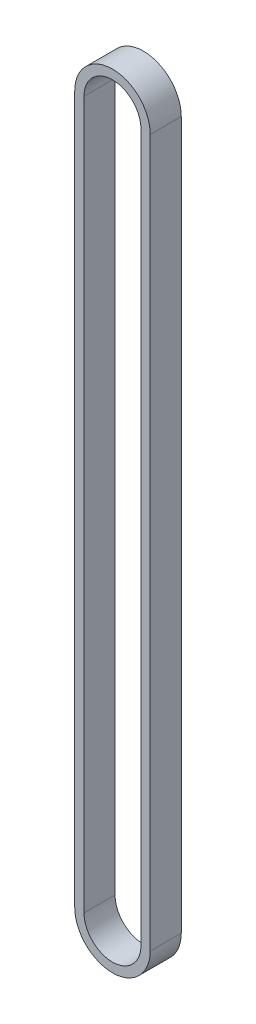
ISO-10303-21;
HEADER;
FILE_DESCRIPTION(('STEP AP214'),'2;1');
FILE_NAME('part.step','',(''),(''),'','','');
FILE_SCHEMA(('AUTOMOTIVE_DESIGN { 1 0 10303 214 1 1 1 1 }'));
ENDSEC;
DATA;
#1=APPLICATION_CONTEXT('core data for automotive mechanical design processes');
#2=APPLICATION_PROTOCOL_DEFINITION('international standard','automotive_design',2000,#1);
#3=PRODUCT_CONTEXT('',#1,'mechanical');
#4=PRODUCT('Part','Part','',(#3));
#5=PRODUCT_RELATED_PRODUCT_CATEGORY('part','',(#4));
#6=PRODUCT_DEFINITION_FORMATION('','',#4);
#7=PRODUCT_DEFINITION_CONTEXT('part definition',#1,'design');
#8=PRODUCT_DEFINITION('design','',#6,#7);
#9=PRODUCT_DEFINITION_SHAPE('','',#8);
#10=(LENGTH_UNIT() NAMED_UNIT(*) SI_UNIT(.MILLI.,.METRE.));
#11=(NAMED_UNIT(*) PLANE_ANGLE_UNIT() SI_UNIT($,.RADIAN.));
#12=(NAMED_UNIT(*) SI_UNIT($,.STERADIAN.) SOLID_ANGLE_UNIT());
#13=UNCERTAINTY_MEASURE_WITH_UNIT(LENGTH_MEASURE(1.E-05),#10,'distance_accuracy_value','');
#14=(GEOMETRIC_REPRESENTATION_CONTEXT(3) GLOBAL_UNCERTAINTY_ASSIGNED_CONTEXT((#13)) GLOBAL_UNIT_ASSIGNED_CONTEXT((#10,
#11,#12)) REPRESENTATION_CONTEXT('',''));
#15=CARTESIAN_POINT('',(0.,0.,0.));
#16=DIRECTION('',(0.,0.,1.));
#17=DIRECTION('',(1.,0.,0.));
#18=AXIS2_PLACEMENT_3D('',#15,#16,#17);
#19=CARTESIAN_POINT('',(0.,-114.,10.));
#20=DIRECTION('',(0.,0.,1.));
#21=DIRECTION('',(1.,0.,0.));
#22=AXIS2_PLACEMENT_3D('',#19,#20,#21);
#23=PLANE('',#22);
#24=CARTESIAN_POINT('',(0.,-114.,10.));
#25=DIRECTION('',(0.,0.,1.));
#26=DIRECTION('',(1.,0.,0.));
#27=AXIS2_PLACEMENT_3D('',#24,#25,#26);
#28=CIRCLE('',#27,12.17);
#29=CARTESIAN_POINT('',(-12.17,-114.,10.));
#30=VERTEX_POINT('',#29);
#31=CARTESIAN_POINT('',(12.17,-114.,10.));
#32=VERTEX_POINT('',#31);
#33=EDGE_CURVE('E157',#30,#32,#28,.T.);
#34=ORIENTED_EDGE('',*,*,#33,.T.);
#35=DIRECTION('',(0.,1.,0.));
#36=VECTOR('',#35,1.);
#37=CARTESIAN_POINT('',(12.17,-114.,10.));
#38=LINE('',#37,#36);
#39=CARTESIAN_POINT('',(12.17,114.,10.));
#40=VERTEX_POINT('',#39);
#41=EDGE_CURVE('E161',#32,#40,#38,.T.);
#42=ORIENTED_EDGE('',*,*,#41,.T.);
#43=CARTESIAN_POINT('',(0.,114.,10.));
#44=DIRECTION('',(0.,0.,1.));
#45=DIRECTION('',(1.,0.,0.));
#46=AXIS2_PLACEMENT_3D('',#43,#44,#45);
#47=CIRCLE('',#46,12.17);
#48=CARTESIAN_POINT('',(-12.17,114.,10.));
#49=VERTEX_POINT('',#48);
#50=EDGE_CURVE('E165',#40,#49,#47,.T.);
#51=ORIENTED_EDGE('',*,*,#50,.T.);
#52=DIRECTION('',(0.,-1.,0.));
#53=VECTOR('',#52,1.);
#54=CARTESIAN_POINT('',(-12.17,-114.,10.));
#55=LINE('',#54,#53);
#56=EDGE_CURVE('E168',#49,#30,#55,.T.);
#57=ORIENTED_EDGE('',*,*,#56,.T.);
#58=EDGE_LOOP('',(#34,#42,#51,#57));
#59=FACE_BOUND('',#58,.T.);
#60=DIRECTION('',(0.,1.,0.));
#61=VECTOR('',#60,1.);
#62=CARTESIAN_POINT('',(9.17000000000004,-114.,10.));
#63=LINE('',#62,#61);
#64=CARTESIAN_POINT('',(9.17000000000004,-114.,10.));
#65=VERTEX_POINT('',#64);
#66=CARTESIAN_POINT('',(9.17,114.,10.));
#67=VERTEX_POINT('',#66);
#68=EDGE_CURVE('E118',#65,#67,#63,.T.);
#69=ORIENTED_EDGE('',*,*,#68,.F.);
#70=CARTESIAN_POINT('',(0.,-114.,10.));
#71=DIRECTION('',(0.,0.,1.));
#72=DIRECTION('',(1.,0.,0.));
#73=AXIS2_PLACEMENT_3D('',#70,#71,#72);
#74=CIRCLE('',#73,9.17000000000004);
#75=CARTESIAN_POINT('',(-9.17000000000004,-114.,10.));
#76=VERTEX_POINT('',#75);
#77=EDGE_CURVE('E109',#76,#65,#74,.T.);
#78=ORIENTED_EDGE('',*,*,#77,.F.);
#79=DIRECTION('',(0.,-1.,0.));
#80=VECTOR('',#79,1.);
#81=CARTESIAN_POINT('',(-9.17000000000004,-114.,10.));
#82=LINE('',#81,#80);
#83=CARTESIAN_POINT('',(-9.17000000000008,114.,10.));
#84=VERTEX_POINT('',#83);
#85=EDGE_CURVE('E135',#84,#76,#82,.T.);
#86=ORIENTED_EDGE('',*,*,#85,.F.);
#87=CARTESIAN_POINT('',(0.,114.,10.));
#88=DIRECTION('',(0.,0.,1.));
#89=DIRECTION('',(1.,0.,0.));
#90=AXIS2_PLACEMENT_3D('',#87,#88,#89);
#91=CIRCLE('',#90,9.17000000000004);
#92=EDGE_CURVE('E131',#67,#84,#91,.T.);
#93=ORIENTED_EDGE('',*,*,#92,.F.);
#94=EDGE_LOOP('',(#69,#78,#86,#93));
#95=FACE_BOUND('',#94,.T.);
#96=ADVANCED_FACE('F43',(#59,#95),#23,.T.);
#97=CARTESIAN_POINT('',(0.,-114.,0.));
#98=DIRECTION('',(0.,0.,1.));
#99=DIRECTION('',(1.,0.,0.));
#100=AXIS2_PLACEMENT_3D('',#97,#98,#99);
#101=PLANE('',#100);
#102=CARTESIAN_POINT('',(0.,-114.,0.));
#103=DIRECTION('',(0.,0.,1.));
#104=DIRECTION('',(1.,0.,0.));
#105=AXIS2_PLACEMENT_3D('',#102,#103,#104);
#106=CIRCLE('',#105,12.17);
#107=CARTESIAN_POINT('',(-12.17,-114.,0.));
#108=VERTEX_POINT('',#107);
#109=CARTESIAN_POINT('',(12.17,-114.,0.));
#110=VERTEX_POINT('',#109);
#111=EDGE_CURVE('E127',#108,#110,#106,.T.);
#112=ORIENTED_EDGE('',*,*,#111,.F.);
#113=DIRECTION('',(0.,-1.,0.));
#114=VECTOR('',#113,1.);
#115=CARTESIAN_POINT('',(-12.17,-114.,0.));
#116=LINE('',#115,#114);
#117=CARTESIAN_POINT('',(-12.17,114.,0.));
#118=VERTEX_POINT('',#117);
#119=EDGE_CURVE('E162',#118,#108,#116,.T.);
#120=ORIENTED_EDGE('',*,*,#119,.F.);
#121=CARTESIAN_POINT('',(0.,114.,0.));
#122=DIRECTION('',(0.,0.,1.));
#123=DIRECTION('',(1.,0.,0.));
#124=AXIS2_PLACEMENT_3D('',#121,#122,#123);
#125=CIRCLE('',#124,12.17);
#126=CARTESIAN_POINT('',(12.17,114.,0.));
#127=VERTEX_POINT('',#126);
#128=EDGE_CURVE('E178',#127,#118,#125,.T.);
#129=ORIENTED_EDGE('',*,*,#128,.F.);
#130=DIRECTION('',(0.,1.,0.));
#131=VECTOR('',#130,1.);
#132=CARTESIAN_POINT('',(12.17,-114.,0.));
#133=LINE('',#132,#131);
#134=EDGE_CURVE('E175',#110,#127,#133,.T.);
#135=ORIENTED_EDGE('',*,*,#134,.F.);
#136=EDGE_LOOP('',(#112,#120,#129,#135));
#137=FACE_BOUND('',#136,.T.);
#138=CARTESIAN_POINT('',(0.,-114.,0.));
#139=DIRECTION('',(0.,0.,1.));
#140=DIRECTION('',(1.,0.,0.));
#141=AXIS2_PLACEMENT_3D('',#138,#139,#140);
#142=CIRCLE('',#141,9.17000000000004);
#143=CARTESIAN_POINT('',(-9.17000000000004,-114.,0.));
#144=VERTEX_POINT('',#143);
#145=CARTESIAN_POINT('',(9.17000000000004,-114.,0.));
#146=VERTEX_POINT('',#145);
#147=EDGE_CURVE('E67',#144,#146,#142,.T.);
#148=ORIENTED_EDGE('',*,*,#147,.T.);
#149=DIRECTION('',(0.,1.,0.));
#150=VECTOR('',#149,1.);
#151=CARTESIAN_POINT('',(9.17000000000004,-114.,0.));
#152=LINE('',#151,#150);
#153=CARTESIAN_POINT('',(9.17,114.,0.));
#154=VERTEX_POINT('',#153);
#155=EDGE_CURVE('E125',#146,#154,#152,.T.);
#156=ORIENTED_EDGE('',*,*,#155,.T.);
#157=CARTESIAN_POINT('',(0.,114.,0.));
#158=DIRECTION('',(0.,0.,1.));
#159=DIRECTION('',(1.,0.,0.));
#160=AXIS2_PLACEMENT_3D('',#157,#158,#159);
#161=CIRCLE('',#160,9.17000000000004);
#162=CARTESIAN_POINT('',(-9.17000000000008,114.,0.));
#163=VERTEX_POINT('',#162);
#164=EDGE_CURVE('E144',#154,#163,#161,.T.);
#165=ORIENTED_EDGE('',*,*,#164,.T.);
#166=DIRECTION('',(0.,-1.,0.));
#167=VECTOR('',#166,1.);
#168=CARTESIAN_POINT('',(-9.17000000000004,-114.,0.));
#169=LINE('',#168,#167);
#170=EDGE_CURVE('E119',#163,#144,#169,.T.);
#171=ORIENTED_EDGE('',*,*,#170,.T.);
#172=EDGE_LOOP('',(#148,#156,#165,#171));
#173=FACE_BOUND('',#172,.T.);
#174=ADVANCED_FACE('F201',(#137,#173),#101,.F.);
#175=CARTESIAN_POINT('',(0.,-114.,10.));
#176=DIRECTION('',(0.,0.,-1.));
#177=DIRECTION('',(-1.,0.,0.));
#178=AXIS2_PLACEMENT_3D('',#175,#176,#177);
#179=CYLINDRICAL_SURFACE('',#178,12.17);
#180=ORIENTED_EDGE('',*,*,#111,.T.);
#181=DIRECTION('',(0.,0.,-1.));
#182=VECTOR('',#181,1.);
#183=CARTESIAN_POINT('',(12.17,-114.,10.));
#184=LINE('',#183,#182);
#185=EDGE_CURVE('E11',#32,#110,#184,.T.);
#186=ORIENTED_EDGE('',*,*,#185,.F.);
#187=ORIENTED_EDGE('',*,*,#33,.F.);
#188=DIRECTION('',(0.,0.,-1.));
#189=VECTOR('',#188,1.);
#190=CARTESIAN_POINT('',(-12.17,-114.,10.));
#191=LINE('',#190,#189);
#192=EDGE_CURVE('E171',#30,#108,#191,.T.);
#193=ORIENTED_EDGE('',*,*,#192,.T.);
#194=EDGE_LOOP('',(#180,#186,#187,#193));
#195=FACE_BOUND('',#194,.T.);
#196=ADVANCED_FACE('F45',(#195),#179,.T.);
#197=CARTESIAN_POINT('',(12.17,-114.,10.));
#198=DIRECTION('',(-1.,0.,0.));
#199=DIRECTION('',(0.,-1.,0.));
#200=AXIS2_PLACEMENT_3D('',#197,#198,#199);
#201=PLANE('',#200);
#202=ORIENTED_EDGE('',*,*,#134,.T.);
#203=DIRECTION('',(0.,0.,-1.));
#204=VECTOR('',#203,1.);
#205=CARTESIAN_POINT('',(12.17,114.,10.));
#206=LINE('',#205,#204);
#207=EDGE_CURVE('E52',#40,#127,#206,.T.);
#208=ORIENTED_EDGE('',*,*,#207,.F.);
#209=ORIENTED_EDGE('',*,*,#41,.F.);
#210=ORIENTED_EDGE('',*,*,#185,.T.);
#211=EDGE_LOOP('',(#202,#208,#209,#210));
#212=FACE_BOUND('',#211,.T.);
#213=ADVANCED_FACE('F211',(#212),#201,.F.);
#214=CARTESIAN_POINT('',(0.,114.,10.));
#215=DIRECTION('',(0.,0.,-1.));
#216=DIRECTION('',(-1.,0.,0.));
#217=AXIS2_PLACEMENT_3D('',#214,#215,#216);
#218=CYLINDRICAL_SURFACE('',#217,12.17);
#219=ORIENTED_EDGE('',*,*,#128,.T.);
#220=DIRECTION('',(0.,0.,-1.));
#221=VECTOR('',#220,1.);
#222=CARTESIAN_POINT('',(-12.17,114.,10.));
#223=LINE('',#222,#221);
#224=EDGE_CURVE('E186',#49,#118,#223,.T.);
#225=ORIENTED_EDGE('',*,*,#224,.F.);
#226=ORIENTED_EDGE('',*,*,#50,.F.);
#227=ORIENTED_EDGE('',*,*,#207,.T.);
#228=EDGE_LOOP('',(#219,#225,#226,#227));
#229=FACE_BOUND('',#228,.T.);
#230=ADVANCED_FACE('F195',(#229),#218,.T.);
#231=CARTESIAN_POINT('',(-12.17,-114.,10.));
#232=DIRECTION('',(1.,0.,0.));
#233=DIRECTION('',(0.,0.,-1.));
#234=AXIS2_PLACEMENT_3D('',#231,#232,#233);
#235=PLANE('',#234);
#236=ORIENTED_EDGE('',*,*,#119,.T.);
#237=ORIENTED_EDGE('',*,*,#192,.F.);
#238=ORIENTED_EDGE('',*,*,#56,.F.);
#239=ORIENTED_EDGE('',*,*,#224,.T.);
#240=EDGE_LOOP('',(#236,#237,#238,#239));
#241=FACE_BOUND('',#240,.T.);
#242=ADVANCED_FACE('F205',(#241),#235,.F.);
#243=CARTESIAN_POINT('',(0.,-114.,10.));
#244=DIRECTION('',(0.,0.,-1.));
#245=DIRECTION('',(-1.,0.,0.));
#246=AXIS2_PLACEMENT_3D('',#243,#244,#245);
#247=CYLINDRICAL_SURFACE('',#246,9.17000000000004);
#248=ORIENTED_EDGE('',*,*,#147,.F.);
#249=DIRECTION('',(0.,0.,-1.));
#250=VECTOR('',#249,1.);
#251=CARTESIAN_POINT('',(-9.17000000000004,-114.,10.));
#252=LINE('',#251,#250);
#253=EDGE_CURVE('E113',#76,#144,#252,.T.);
#254=ORIENTED_EDGE('',*,*,#253,.F.);
#255=ORIENTED_EDGE('',*,*,#77,.T.);
#256=DIRECTION('',(0.,0.,-1.));
#257=VECTOR('',#256,1.);
#258=CARTESIAN_POINT('',(9.17000000000004,-114.,10.));
#259=LINE('',#258,#257);
#260=EDGE_CURVE('E112',#65,#146,#259,.T.);
#261=ORIENTED_EDGE('',*,*,#260,.T.);
#262=EDGE_LOOP('',(#248,#254,#255,#261));
#263=FACE_BOUND('',#262,.T.);
#264=ADVANCED_FACE('F111',(#263),#247,.F.);
#265=CARTESIAN_POINT('',(9.17000000000004,-114.,10.));
#266=DIRECTION('',(-1.,0.,0.));
#267=DIRECTION('',(0.,-1.,0.));
#268=AXIS2_PLACEMENT_3D('',#265,#266,#267);
#269=PLANE('',#268);
#270=ORIENTED_EDGE('',*,*,#155,.F.);
#271=ORIENTED_EDGE('',*,*,#260,.F.);
#272=ORIENTED_EDGE('',*,*,#68,.T.);
#273=DIRECTION('',(0.,0.,-1.));
#274=VECTOR('',#273,1.);
#275=CARTESIAN_POINT('',(9.17,114.,10.));
#276=LINE('',#275,#274);
#277=EDGE_CURVE('E128',#67,#154,#276,.T.);
#278=ORIENTED_EDGE('',*,*,#277,.T.);
#279=EDGE_LOOP('',(#270,#271,#272,#278));
#280=FACE_BOUND('',#279,.T.);
#281=ADVANCED_FACE('F122',(#280),#269,.T.);
#282=CARTESIAN_POINT('',(0.,114.,10.));
#283=DIRECTION('',(0.,0.,-1.));
#284=DIRECTION('',(-1.,0.,0.));
#285=AXIS2_PLACEMENT_3D('',#282,#283,#284);
#286=CYLINDRICAL_SURFACE('',#285,9.17000000000004);
#287=ORIENTED_EDGE('',*,*,#164,.F.);
#288=ORIENTED_EDGE('',*,*,#277,.F.);
#289=ORIENTED_EDGE('',*,*,#92,.T.);
#290=DIRECTION('',(0.,0.,-1.));
#291=VECTOR('',#290,1.);
#292=CARTESIAN_POINT('',(-9.17000000000008,114.,10.));
#293=LINE('',#292,#291);
#294=EDGE_CURVE('E59',#84,#163,#293,.T.);
#295=ORIENTED_EDGE('',*,*,#294,.T.);
#296=EDGE_LOOP('',(#287,#288,#289,#295));
#297=FACE_BOUND('',#296,.T.);
#298=ADVANCED_FACE('F234',(#297),#286,.F.);
#299=CARTESIAN_POINT('',(-9.17000000000004,-114.,10.));
#300=DIRECTION('',(1.,0.,0.));
#301=DIRECTION('',(0.,1.,0.));
#302=AXIS2_PLACEMENT_3D('',#299,#300,#301);
#303=PLANE('',#302);
#304=ORIENTED_EDGE('',*,*,#170,.F.);
#305=ORIENTED_EDGE('',*,*,#294,.F.);
#306=ORIENTED_EDGE('',*,*,#85,.T.);
#307=ORIENTED_EDGE('',*,*,#253,.T.);
#308=EDGE_LOOP('',(#304,#305,#306,#307));
#309=FACE_BOUND('',#308,.T.);
#310=ADVANCED_FACE('F238',(#309),#303,.T.);
#311=CLOSED_SHELL('',(#96,#174,#196,#213,#230,#242,#264,#281,#298,#310));
#312=MANIFOLD_SOLID_BREP('B2',#311);
#313=ADVANCED_BREP_SHAPE_REPRESENTATION('',(#18,#312),#14);
#314=SHAPE_DEFINITION_REPRESENTATION(#9,#313);
ENDSEC;
END-ISO-10303-21;
